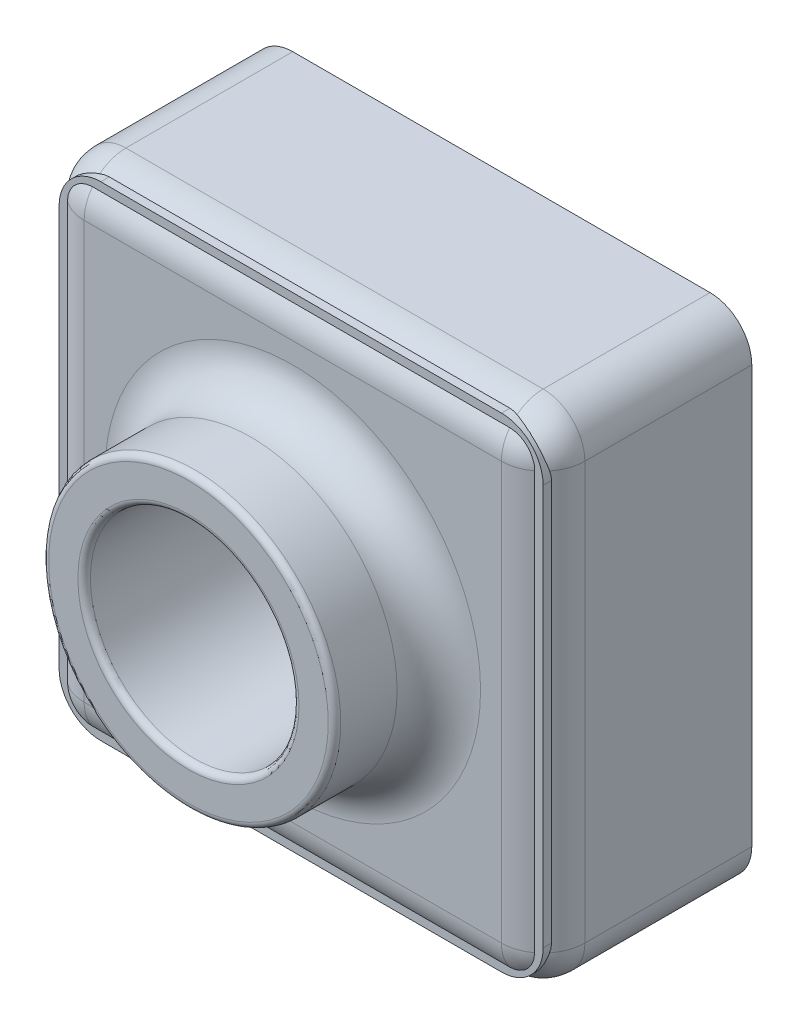
ISO-10303-21;
HEADER;
FILE_DESCRIPTION(('STEP AP214'),'2;1');
FILE_NAME('part.step','',(''),(''),'','','');
FILE_SCHEMA(('AUTOMOTIVE_DESIGN { 1 0 10303 214 1 1 1 1 }'));
ENDSEC;
DATA;
#1=APPLICATION_CONTEXT('core data for automotive mechanical design processes');
#2=APPLICATION_PROTOCOL_DEFINITION('international standard','automotive_design',2000,#1);
#3=PRODUCT_CONTEXT('',#1,'mechanical');
#4=PRODUCT('Part','Part','',(#3));
#5=PRODUCT_RELATED_PRODUCT_CATEGORY('part','',(#4));
#6=PRODUCT_DEFINITION_FORMATION('','',#4);
#7=PRODUCT_DEFINITION_CONTEXT('part definition',#1,'design');
#8=PRODUCT_DEFINITION('design','',#6,#7);
#9=PRODUCT_DEFINITION_SHAPE('','',#8);
#10=(LENGTH_UNIT() NAMED_UNIT(*) SI_UNIT(.MILLI.,.METRE.));
#11=(NAMED_UNIT(*) PLANE_ANGLE_UNIT() SI_UNIT($,.RADIAN.));
#12=(NAMED_UNIT(*) SI_UNIT($,.STERADIAN.) SOLID_ANGLE_UNIT());
#13=UNCERTAINTY_MEASURE_WITH_UNIT(LENGTH_MEASURE(1.E-05),#10,'distance_accuracy_value','');
#14=(GEOMETRIC_REPRESENTATION_CONTEXT(3) GLOBAL_UNCERTAINTY_ASSIGNED_CONTEXT((#13)) GLOBAL_UNIT_ASSIGNED_CONTEXT((#10,
#11,#12)) REPRESENTATION_CONTEXT('',''));
#15=CARTESIAN_POINT('',(0.,0.,0.));
#16=DIRECTION('',(0.,0.,1.));
#17=DIRECTION('',(1.,0.,0.));
#18=AXIS2_PLACEMENT_3D('',#15,#16,#17);
#19=CARTESIAN_POINT('',(0.,0.,0.));
#20=DIRECTION('',(0.,0.,1.));
#21=DIRECTION('',(1.,0.,0.));
#22=AXIS2_PLACEMENT_3D('',#19,#20,#21);
#23=PLANE('',#22);
#24=CARTESIAN_POINT('',(14.1686746987952,-12.4337349397591,0.));
#25=DIRECTION('',(0.,0.,1.));
#26=DIRECTION('',(1.,0.,0.));
#27=AXIS2_PLACEMENT_3D('',#24,#25,#26);
#28=CIRCLE('',#27,25.);
#29=CARTESIAN_POINT('',(39.1686746987952,-12.4337349397591,0.));
#30=VERTEX_POINT('',#29);
#31=EDGE_CURVE('E313',#30,#30,#28,.T.);
#32=ORIENTED_EDGE('',*,*,#31,.T.);
#33=EDGE_LOOP('',(#32));
#34=FACE_BOUND('',#33,.T.);
#35=CARTESIAN_POINT('',(14.1686746987952,-12.4337349397591,0.));
#36=DIRECTION('',(0.,0.,1.));
#37=DIRECTION('',(1.,0.,0.));
#38=AXIS2_PLACEMENT_3D('',#35,#36,#37);
#39=CIRCLE('',#38,27.);
#40=CARTESIAN_POINT('',(41.1686746987952,-12.4337349397591,0.));
#41=VERTEX_POINT('',#40);
#42=EDGE_CURVE('E300',#41,#41,#39,.T.);
#43=ORIENTED_EDGE('',*,*,#42,.F.);
#44=EDGE_LOOP('',(#43));
#45=FACE_BOUND('',#44,.T.);
#46=ADVANCED_FACE('F45',(#34,#45),#23,.F.);
#47=CARTESIAN_POINT('',(-45.8313253012048,47.5662650602409,50.));
#48=DIRECTION('',(1.,0.,0.));
#49=DIRECTION('',(0.,1.,0.));
#50=AXIS2_PLACEMENT_3D('',#47,#48,#49);
#51=PLANE('',#50);
#52=DIRECTION('',(0.,-1.,0.));
#53=VECTOR('',#52,1.);
#54=CARTESIAN_POINT('',(-45.8313253012048,47.5662650602409,40.));
#55=LINE('',#54,#53);
#56=CARTESIAN_POINT('',(-45.8313253012048,-62.4337349397591,40.));
#57=VERTEX_POINT('',#56);
#58=CARTESIAN_POINT('',(-45.8313253012048,37.5662650602409,40.));
#59=VERTEX_POINT('',#58);
#60=EDGE_CURVE('E233',#57,#59,#55,.F.);
#61=ORIENTED_EDGE('',*,*,#60,.T.);
#62=DIRECTION('',(0.,0.,-1.));
#63=VECTOR('',#62,1.);
#64=CARTESIAN_POINT('',(-45.8313253012048,37.5662650602409,50.));
#65=LINE('',#64,#63);
#66=CARTESIAN_POINT('',(-45.8313253012048,37.5662650602409,0.));
#67=VERTEX_POINT('',#66);
#68=EDGE_CURVE('E235',#59,#67,#65,.T.);
#69=ORIENTED_EDGE('',*,*,#68,.T.);
#70=DIRECTION('',(0.,-1.,0.));
#71=VECTOR('',#70,1.);
#72=CARTESIAN_POINT('',(-45.8313253012048,47.5662650602409,0.));
#73=LINE('',#72,#71);
#74=CARTESIAN_POINT('',(-45.8313253012048,-62.433734939759,0.));
#75=VERTEX_POINT('',#74);
#76=EDGE_CURVE('E316',#67,#75,#73,.T.);
#77=ORIENTED_EDGE('',*,*,#76,.T.);
#78=DIRECTION('',(0.,0.,-1.));
#79=VECTOR('',#78,1.);
#80=CARTESIAN_POINT('',(-45.8313253012048,-62.433734939759,50.));
#81=LINE('',#80,#79);
#82=EDGE_CURVE('E231',#75,#57,#81,.F.);
#83=ORIENTED_EDGE('',*,*,#82,.T.);
#84=EDGE_LOOP('',(#61,#69,#77,#83));
#85=FACE_BOUND('',#84,.T.);
#86=ADVANCED_FACE('F369',(#85),#51,.F.);
#87=CARTESIAN_POINT('',(-45.8313253012048,-72.433734939759,50.));
#88=DIRECTION('',(0.,1.,0.));
#89=DIRECTION('',(0.,0.,1.));
#90=AXIS2_PLACEMENT_3D('',#87,#88,#89);
#91=PLANE('',#90);
#92=DIRECTION('',(1.,0.,0.));
#93=VECTOR('',#92,1.);
#94=CARTESIAN_POINT('',(-45.8313253012048,-72.433734939759,40.));
#95=LINE('',#94,#93);
#96=CARTESIAN_POINT('',(64.1686746987952,-72.433734939759,40.));
#97=VERTEX_POINT('',#96);
#98=CARTESIAN_POINT('',(-35.8313253012048,-72.433734939759,40.));
#99=VERTEX_POINT('',#98);
#100=EDGE_CURVE('E227',#97,#99,#95,.F.);
#101=ORIENTED_EDGE('',*,*,#100,.T.);
#102=DIRECTION('',(0.,0.,-1.));
#103=VECTOR('',#102,1.);
#104=CARTESIAN_POINT('',(-35.8313253012048,-72.433734939759,50.));
#105=LINE('',#104,#103);
#106=CARTESIAN_POINT('',(-35.8313253012048,-72.433734939759,0.));
#107=VERTEX_POINT('',#106);
#108=EDGE_CURVE('E229',#99,#107,#105,.T.);
#109=ORIENTED_EDGE('',*,*,#108,.T.);
#110=DIRECTION('',(1.,0.,0.));
#111=VECTOR('',#110,1.);
#112=CARTESIAN_POINT('',(-45.8313253012048,-72.433734939759,0.));
#113=LINE('',#112,#111);
#114=CARTESIAN_POINT('',(64.1686746987952,-72.433734939759,0.));
#115=VERTEX_POINT('',#114);
#116=EDGE_CURVE('E320',#107,#115,#113,.T.);
#117=ORIENTED_EDGE('',*,*,#116,.T.);
#118=DIRECTION('',(0.,0.,-1.));
#119=VECTOR('',#118,1.);
#120=CARTESIAN_POINT('',(64.1686746987952,-72.433734939759,50.));
#121=LINE('',#120,#119);
#122=EDGE_CURVE('E225',#115,#97,#121,.F.);
#123=ORIENTED_EDGE('',*,*,#122,.T.);
#124=EDGE_LOOP('',(#101,#109,#117,#123));
#125=FACE_BOUND('',#124,.T.);
#126=ADVANCED_FACE('F397',(#125),#91,.F.);
#127=CARTESIAN_POINT('',(74.1686746987952,47.5662650602409,50.));
#128=DIRECTION('',(-1.,0.,0.));
#129=DIRECTION('',(0.,0.,1.));
#130=AXIS2_PLACEMENT_3D('',#127,#128,#129);
#131=PLANE('',#130);
#132=DIRECTION('',(0.,1.,0.));
#133=VECTOR('',#132,1.);
#134=CARTESIAN_POINT('',(74.1686746987952,47.5662650602409,0.));
#135=LINE('',#134,#133);
#136=CARTESIAN_POINT('',(74.1686746987952,-62.433734939759,0.));
#137=VERTEX_POINT('',#136);
#138=CARTESIAN_POINT('',(74.1686746987952,37.5662650602409,0.));
#139=VERTEX_POINT('',#138);
#140=EDGE_CURVE('E323',#137,#139,#135,.T.);
#141=ORIENTED_EDGE('',*,*,#140,.T.);
#142=DIRECTION('',(0.,0.,-1.));
#143=VECTOR('',#142,1.);
#144=CARTESIAN_POINT('',(74.1686746987952,37.5662650602409,50.));
#145=LINE('',#144,#143);
#146=CARTESIAN_POINT('',(74.1686746987952,37.5662650602409,40.));
#147=VERTEX_POINT('',#146);
#148=EDGE_CURVE('E223',#139,#147,#145,.F.);
#149=ORIENTED_EDGE('',*,*,#148,.T.);
#150=DIRECTION('',(0.,1.,0.));
#151=VECTOR('',#150,1.);
#152=CARTESIAN_POINT('',(74.1686746987952,-72.433734939759,40.));
#153=LINE('',#152,#151);
#154=CARTESIAN_POINT('',(74.1686746987952,-62.433734939759,40.));
#155=VERTEX_POINT('',#154);
#156=EDGE_CURVE('E221',#147,#155,#153,.F.);
#157=ORIENTED_EDGE('',*,*,#156,.T.);
#158=DIRECTION('',(0.,0.,-1.));
#159=VECTOR('',#158,1.);
#160=CARTESIAN_POINT('',(74.1686746987952,-62.433734939759,50.));
#161=LINE('',#160,#159);
#162=EDGE_CURVE('E219',#155,#137,#161,.T.);
#163=ORIENTED_EDGE('',*,*,#162,.T.);
#164=EDGE_LOOP('',(#141,#149,#157,#163));
#165=FACE_BOUND('',#164,.T.);
#166=ADVANCED_FACE('F599',(#165),#131,.F.);
#167=CARTESIAN_POINT('',(-45.8313253012048,47.5662650602409,50.));
#168=DIRECTION('',(0.,-1.,0.));
#169=DIRECTION('',(0.,0.,-1.));
#170=AXIS2_PLACEMENT_3D('',#167,#168,#169);
#171=PLANE('',#170);
#172=DIRECTION('',(-1.,0.,0.));
#173=VECTOR('',#172,1.);
#174=CARTESIAN_POINT('',(74.1686746987952,47.5662650602409,40.));
#175=LINE('',#174,#173);
#176=CARTESIAN_POINT('',(-35.8313253012048,47.5662650602409,40.));
#177=VERTEX_POINT('',#176);
#178=CARTESIAN_POINT('',(64.1686746987952,47.5662650602409,40.));
#179=VERTEX_POINT('',#178);
#180=EDGE_CURVE('E180',#177,#179,#175,.F.);
#181=ORIENTED_EDGE('',*,*,#180,.T.);
#182=DIRECTION('',(0.,0.,-1.));
#183=VECTOR('',#182,1.);
#184=CARTESIAN_POINT('',(64.1686746987952,47.5662650602409,50.));
#185=LINE('',#184,#183);
#186=CARTESIAN_POINT('',(64.1686746987952,47.5662650602409,0.));
#187=VERTEX_POINT('',#186);
#188=EDGE_CURVE('E217',#179,#187,#185,.T.);
#189=ORIENTED_EDGE('',*,*,#188,.T.);
#190=DIRECTION('',(-1.,0.,0.));
#191=VECTOR('',#190,1.);
#192=CARTESIAN_POINT('',(-45.8313253012048,47.5662650602409,0.));
#193=LINE('',#192,#191);
#194=CARTESIAN_POINT('',(-35.8313253012048,47.5662650602409,0.));
#195=VERTEX_POINT('',#194);
#196=EDGE_CURVE('E326',#187,#195,#193,.T.);
#197=ORIENTED_EDGE('',*,*,#196,.T.);
#198=DIRECTION('',(0.,0.,-1.));
#199=VECTOR('',#198,1.);
#200=CARTESIAN_POINT('',(-35.8313253012048,47.5662650602409,50.));
#201=LINE('',#200,#199);
#202=EDGE_CURVE('E210',#195,#177,#201,.F.);
#203=ORIENTED_EDGE('',*,*,#202,.T.);
#204=EDGE_LOOP('',(#181,#189,#197,#203));
#205=FACE_BOUND('',#204,.T.);
#206=ADVANCED_FACE('F361',(#205),#171,.F.);
#207=CARTESIAN_POINT('',(0.,0.,50.));
#208=DIRECTION('',(0.,0.,1.));
#209=DIRECTION('',(1.,0.,0.));
#210=AXIS2_PLACEMENT_3D('',#207,#208,#209);
#211=PLANE('',#210);
#212=DIRECTION('',(0.,1.,0.));
#213=VECTOR('',#212,1.);
#214=CARTESIAN_POINT('',(64.1686746987952,47.5662650602409,50.));
#215=LINE('',#214,#213);
#216=CARTESIAN_POINT('',(64.1686746987952,-62.4337349397591,50.));
#217=VERTEX_POINT('',#216);
#218=CARTESIAN_POINT('',(64.1686746987952,37.5662650602409,50.));
#219=VERTEX_POINT('',#218);
#220=EDGE_CURVE('E208',#217,#219,#215,.T.);
#221=ORIENTED_EDGE('',*,*,#220,.T.);
#222=DIRECTION('',(-1.,0.,0.));
#223=VECTOR('',#222,1.);
#224=CARTESIAN_POINT('',(-45.8313253012048,37.5662650602409,50.));
#225=LINE('',#224,#223);
#226=CARTESIAN_POINT('',(-35.8313253012048,37.5662650602409,50.));
#227=VERTEX_POINT('',#226);
#228=EDGE_CURVE('E178',#219,#227,#225,.T.);
#229=ORIENTED_EDGE('',*,*,#228,.T.);
#230=DIRECTION('',(0.,-1.,0.));
#231=VECTOR('',#230,1.);
#232=CARTESIAN_POINT('',(-35.8313253012048,-72.433734939759,50.));
#233=LINE('',#232,#231);
#234=CARTESIAN_POINT('',(-35.8313253012048,-62.4337349397591,50.));
#235=VERTEX_POINT('',#234);
#236=EDGE_CURVE('E196',#227,#235,#233,.T.);
#237=ORIENTED_EDGE('',*,*,#236,.T.);
#238=DIRECTION('',(1.,0.,0.));
#239=VECTOR('',#238,1.);
#240=CARTESIAN_POINT('',(74.1686746987952,-62.4337349397591,50.));
#241=LINE('',#240,#239);
#242=EDGE_CURVE('E202',#235,#217,#241,.T.);
#243=ORIENTED_EDGE('',*,*,#242,.T.);
#244=EDGE_LOOP('',(#221,#229,#237,#243));
#245=FACE_BOUND('',#244,.T.);
#246=CARTESIAN_POINT('',(14.1686746987952,-12.4337349397591,50.));
#247=DIRECTION('',(0.,0.,1.));
#248=DIRECTION('',(1.,0.,0.));
#249=AXIS2_PLACEMENT_3D('',#246,#247,#248);
#250=CIRCLE('',#249,45.);
#251=CARTESIAN_POINT('',(59.1686746987952,-12.4337349397591,50.));
#252=VERTEX_POINT('',#251);
#253=EDGE_CURVE('E203',#252,#252,#250,.F.);
#254=ORIENTED_EDGE('',*,*,#253,.T.);
#255=EDGE_LOOP('',(#254));
#256=FACE_BOUND('',#255,.T.);
#257=ADVANCED_FACE('F205',(#245,#256),#211,.T.);
#258=DIRECTION('',(0.,1.,0.));
#259=VECTOR('',#258,1.);
#260=CARTESIAN_POINT('',(72.1686746987952,47.5662650602409,0.));
#261=LINE('',#260,#259);
#262=CARTESIAN_POINT('',(72.1686746987952,-60.433734939759,0.));
#263=VERTEX_POINT('',#262);
#264=CARTESIAN_POINT('',(72.1686746987952,35.5662650602409,0.));
#265=VERTEX_POINT('',#264);
#266=EDGE_CURVE('E412',#263,#265,#261,.T.);
#267=ORIENTED_EDGE('',*,*,#266,.T.);
#268=CARTESIAN_POINT('',(62.1686746987952,35.5662650602409,0.));
#269=DIRECTION('',(0.,0.,1.));
#270=DIRECTION('',(1.,0.,0.));
#271=AXIS2_PLACEMENT_3D('',#268,#269,#270);
#272=CIRCLE('',#271,10.);
#273=CARTESIAN_POINT('',(62.1686746987952,45.5662650602409,0.));
#274=VERTEX_POINT('',#273);
#275=EDGE_CURVE('E70',#265,#274,#272,.T.);
#276=ORIENTED_EDGE('',*,*,#275,.T.);
#277=DIRECTION('',(-1.,0.,0.));
#278=VECTOR('',#277,1.);
#279=CARTESIAN_POINT('',(-45.8313253012048,45.5662650602409,0.));
#280=LINE('',#279,#278);
#281=CARTESIAN_POINT('',(-33.8313253012048,45.5662650602409,0.));
#282=VERTEX_POINT('',#281);
#283=EDGE_CURVE('E416',#274,#282,#280,.T.);
#284=ORIENTED_EDGE('',*,*,#283,.T.);
#285=CARTESIAN_POINT('',(-33.8313253012048,35.5662650602409,0.));
#286=DIRECTION('',(0.,0.,1.));
#287=DIRECTION('',(1.,0.,0.));
#288=AXIS2_PLACEMENT_3D('',#285,#286,#287);
#289=CIRCLE('',#288,10.);
#290=CARTESIAN_POINT('',(-43.8313253012048,35.5662650602409,0.));
#291=VERTEX_POINT('',#290);
#292=EDGE_CURVE('E62',#282,#291,#289,.T.);
#293=ORIENTED_EDGE('',*,*,#292,.T.);
#294=DIRECTION('',(0.,-1.,0.));
#295=VECTOR('',#294,1.);
#296=CARTESIAN_POINT('',(-43.8313253012048,47.5662650602409,0.));
#297=LINE('',#296,#295);
#298=CARTESIAN_POINT('',(-43.8313253012048,-60.433734939759,0.));
#299=VERTEX_POINT('',#298);
#300=EDGE_CURVE('E303',#291,#299,#297,.T.);
#301=ORIENTED_EDGE('',*,*,#300,.T.);
#302=CARTESIAN_POINT('',(-33.8313253012048,-60.433734939759,0.));
#303=DIRECTION('',(0.,0.,1.));
#304=DIRECTION('',(1.,0.,0.));
#305=AXIS2_PLACEMENT_3D('',#302,#303,#304);
#306=CIRCLE('',#305,10.);
#307=CARTESIAN_POINT('',(-33.8313253012048,-70.433734939759,0.));
#308=VERTEX_POINT('',#307);
#309=EDGE_CURVE('E267',#299,#308,#306,.T.);
#310=ORIENTED_EDGE('',*,*,#309,.T.);
#311=DIRECTION('',(1.,0.,0.));
#312=VECTOR('',#311,1.);
#313=CARTESIAN_POINT('',(-45.8313253012048,-70.433734939759,0.));
#314=LINE('',#313,#312);
#315=CARTESIAN_POINT('',(62.1686746987952,-70.433734939759,0.));
#316=VERTEX_POINT('',#315);
#317=EDGE_CURVE('E308',#308,#316,#314,.T.);
#318=ORIENTED_EDGE('',*,*,#317,.T.);
#319=CARTESIAN_POINT('',(62.1686746987952,-60.433734939759,0.));
#320=DIRECTION('',(0.,0.,1.));
#321=DIRECTION('',(1.,0.,0.));
#322=AXIS2_PLACEMENT_3D('',#319,#320,#321);
#323=CIRCLE('',#322,10.);
#324=EDGE_CURVE('E269',#316,#263,#323,.T.);
#325=ORIENTED_EDGE('',*,*,#324,.T.);
#326=EDGE_LOOP('',(#267,#276,#284,#293,#301,#310,#318,#325));
#327=FACE_BOUND('',#326,.T.);
#328=ORIENTED_EDGE('',*,*,#196,.F.);
#329=CARTESIAN_POINT('',(64.1686746987952,37.5662650602409,0.));
#330=DIRECTION('',(0.,0.,1.));
#331=DIRECTION('',(1.,0.,0.));
#332=AXIS2_PLACEMENT_3D('',#329,#330,#331);
#333=CIRCLE('',#332,10.);
#334=EDGE_CURVE('E12',#187,#139,#333,.F.);
#335=ORIENTED_EDGE('',*,*,#334,.T.);
#336=ORIENTED_EDGE('',*,*,#140,.F.);
#337=CARTESIAN_POINT('',(64.1686746987952,-62.433734939759,0.));
#338=DIRECTION('',(0.,0.,1.));
#339=DIRECTION('',(1.,0.,0.));
#340=AXIS2_PLACEMENT_3D('',#337,#338,#339);
#341=CIRCLE('',#340,10.);
#342=EDGE_CURVE('E273',#137,#115,#341,.F.);
#343=ORIENTED_EDGE('',*,*,#342,.T.);
#344=ORIENTED_EDGE('',*,*,#116,.F.);
#345=CARTESIAN_POINT('',(-35.8313253012048,-62.4337349397591,0.));
#346=DIRECTION('',(0.,0.,1.));
#347=DIRECTION('',(1.,0.,0.));
#348=AXIS2_PLACEMENT_3D('',#345,#346,#347);
#349=CIRCLE('',#348,10.);
#350=EDGE_CURVE('E275',#107,#75,#349,.F.);
#351=ORIENTED_EDGE('',*,*,#350,.T.);
#352=ORIENTED_EDGE('',*,*,#76,.F.);
#353=CARTESIAN_POINT('',(-35.8313253012048,37.5662650602409,0.));
#354=DIRECTION('',(0.,0.,1.));
#355=DIRECTION('',(1.,0.,0.));
#356=AXIS2_PLACEMENT_3D('',#353,#354,#355);
#357=CIRCLE('',#356,10.);
#358=EDGE_CURVE('E54',#67,#195,#357,.F.);
#359=ORIENTED_EDGE('',*,*,#358,.T.);
#360=EDGE_LOOP('',(#328,#335,#336,#343,#344,#351,#352,#359));
#361=FACE_BOUND('',#360,.T.);
#362=ADVANCED_FACE('F372',(#327,#361),#23,.F.);
#363=CARTESIAN_POINT('',(14.1686746987952,-12.4337349397591,75.));
#364=DIRECTION('',(0.,0.,-1.));
#365=DIRECTION('',(-1.,0.,0.));
#366=AXIS2_PLACEMENT_3D('',#363,#364,#365);
#367=CYLINDRICAL_SURFACE('',#366,35.);
#368=CARTESIAN_POINT('',(14.1686746987952,-12.4337349397591,60.));
#369=DIRECTION('',(0.,0.,1.));
#370=DIRECTION('',(1.,0.,0.));
#371=AXIS2_PLACEMENT_3D('',#368,#369,#370);
#372=CIRCLE('',#371,35.);
#373=CARTESIAN_POINT('',(49.1686746987952,-12.4337349397591,60.));
#374=VERTEX_POINT('',#373);
#375=EDGE_CURVE('E237',#374,#374,#372,.T.);
#376=ORIENTED_EDGE('',*,*,#375,.T.);
#377=EDGE_LOOP('',(#376));
#378=FACE_BOUND('',#377,.T.);
#379=CARTESIAN_POINT('',(14.1686746987952,-12.4337349397591,73.5));
#380=DIRECTION('',(0.,0.,1.));
#381=DIRECTION('',(1.,0.,0.));
#382=AXIS2_PLACEMENT_3D('',#379,#380,#381);
#383=CIRCLE('',#382,35.);
#384=CARTESIAN_POINT('',(49.1686746987952,-12.4337349397591,73.5));
#385=VERTEX_POINT('',#384);
#386=EDGE_CURVE('E335',#385,#385,#383,.F.);
#387=ORIENTED_EDGE('',*,*,#386,.T.);
#388=EDGE_LOOP('',(#387));
#389=FACE_BOUND('',#388,.T.);
#390=ADVANCED_FACE('F403',(#378,#389),#367,.T.);
#391=CARTESIAN_POINT('',(14.1686746987952,-12.4337349397591,75.));
#392=DIRECTION('',(0.,0.,1.));
#393=DIRECTION('',(1.,0.,0.));
#394=AXIS2_PLACEMENT_3D('',#391,#392,#393);
#395=PLANE('',#394);
#396=CARTESIAN_POINT('',(14.1686746987952,-12.4337349397591,75.));
#397=DIRECTION('',(0.,0.,1.));
#398=DIRECTION('',(1.,0.,0.));
#399=AXIS2_PLACEMENT_3D('',#396,#397,#398);
#400=CIRCLE('',#399,33.5);
#401=CARTESIAN_POINT('',(47.6686746987952,-12.4337349397591,75.));
#402=VERTEX_POINT('',#401);
#403=EDGE_CURVE('E332',#402,#402,#400,.T.);
#404=ORIENTED_EDGE('',*,*,#403,.T.);
#405=EDGE_LOOP('',(#404));
#406=FACE_BOUND('',#405,.T.);
#407=CARTESIAN_POINT('',(14.1686746987952,-12.4337349397591,75.));
#408=DIRECTION('',(0.,0.,1.));
#409=DIRECTION('',(1.,0.,0.));
#410=AXIS2_PLACEMENT_3D('',#407,#408,#409);
#411=CIRCLE('',#410,26.5);
#412=CARTESIAN_POINT('',(40.6686746987952,-12.4337349397591,75.));
#413=VERTEX_POINT('',#412);
#414=EDGE_CURVE('E329',#413,#413,#411,.F.);
#415=ORIENTED_EDGE('',*,*,#414,.T.);
#416=EDGE_LOOP('',(#415));
#417=FACE_BOUND('',#416,.T.);
#418=ADVANCED_FACE('F408',(#406,#417),#395,.T.);
#419=CARTESIAN_POINT('',(14.1686746987952,-12.4337349397591,0.));
#420=DIRECTION('',(0.,0.,1.));
#421=DIRECTION('',(1.,0.,0.));
#422=AXIS2_PLACEMENT_3D('',#419,#420,#421);
#423=CYLINDRICAL_SURFACE('',#422,25.);
#424=CARTESIAN_POINT('',(14.1686746987952,-12.4337349397591,73.5));
#425=DIRECTION('',(0.,0.,1.));
#426=DIRECTION('',(1.,0.,0.));
#427=AXIS2_PLACEMENT_3D('',#424,#425,#426);
#428=CIRCLE('',#427,25.);
#429=CARTESIAN_POINT('',(39.1686746987952,-12.4337349397591,73.5));
#430=VERTEX_POINT('',#429);
#431=EDGE_CURVE('E338',#430,#430,#428,.T.);
#432=ORIENTED_EDGE('',*,*,#431,.T.);
#433=EDGE_LOOP('',(#432));
#434=FACE_BOUND('',#433,.T.);
#435=ORIENTED_EDGE('',*,*,#31,.F.);
#436=EDGE_LOOP('',(#435));
#437=FACE_BOUND('',#436,.T.);
#438=ADVANCED_FACE('F594',(#434,#437),#423,.F.);
#439=CARTESIAN_POINT('',(14.1686746987952,-12.4337349397591,73.5));
#440=DIRECTION('',(0.,0.,1.));
#441=DIRECTION('',(1.,0.,0.));
#442=AXIS2_PLACEMENT_3D('',#439,#440,#441);
#443=TOROIDAL_SURFACE('',#442,33.5,1.5);
#444=ORIENTED_EDGE('',*,*,#386,.F.);
#445=EDGE_LOOP('',(#444));
#446=FACE_BOUND('',#445,.T.);
#447=ORIENTED_EDGE('',*,*,#403,.F.);
#448=EDGE_LOOP('',(#447));
#449=FACE_BOUND('',#448,.T.);
#450=ADVANCED_FACE('F591',(#446,#449),#443,.T.);
#451=CARTESIAN_POINT('',(14.1686746987952,-12.4337349397591,73.5));
#452=DIRECTION('',(0.,0.,1.));
#453=DIRECTION('',(1.,0.,0.));
#454=AXIS2_PLACEMENT_3D('',#451,#452,#453);
#455=TOROIDAL_SURFACE('',#454,26.5,1.5);
#456=ORIENTED_EDGE('',*,*,#414,.F.);
#457=EDGE_LOOP('',(#456));
#458=FACE_BOUND('',#457,.T.);
#459=ORIENTED_EDGE('',*,*,#431,.F.);
#460=EDGE_LOOP('',(#459));
#461=FACE_BOUND('',#460,.T.);
#462=ADVANCED_FACE('F589',(#458,#461),#455,.T.);
#463=CARTESIAN_POINT('',(-43.8313253012048,47.5662650602409,50.));
#464=DIRECTION('',(1.,0.,0.));
#465=DIRECTION('',(0.,1.,0.));
#466=AXIS2_PLACEMENT_3D('',#463,#464,#465);
#467=PLANE('',#466);
#468=DIRECTION('',(0.,-1.,0.));
#469=VECTOR('',#468,1.);
#470=CARTESIAN_POINT('',(-43.8313253012048,47.5662650602409,48.));
#471=LINE('',#470,#469);
#472=CARTESIAN_POINT('',(-43.8313253012048,35.5662650602409,48.));
#473=VERTEX_POINT('',#472);
#474=CARTESIAN_POINT('',(-43.8313253012048,-60.433734939759,48.));
#475=VERTEX_POINT('',#474);
#476=EDGE_CURVE('E417',#473,#475,#471,.T.);
#477=ORIENTED_EDGE('',*,*,#476,.T.);
#478=DIRECTION('',(0.,0.,-1.));
#479=VECTOR('',#478,1.);
#480=CARTESIAN_POINT('',(-43.8313253012048,-60.433734939759,0.));
#481=LINE('',#480,#479);
#482=EDGE_CURVE('E242',#475,#299,#481,.T.);
#483=ORIENTED_EDGE('',*,*,#482,.T.);
#484=ORIENTED_EDGE('',*,*,#300,.F.);
#485=DIRECTION('',(0.,0.,-1.));
#486=VECTOR('',#485,1.);
#487=CARTESIAN_POINT('',(-43.8313253012048,35.5662650602409,48.));
#488=LINE('',#487,#486);
#489=EDGE_CURVE('E240',#291,#473,#488,.F.);
#490=ORIENTED_EDGE('',*,*,#489,.T.);
#491=EDGE_LOOP('',(#477,#483,#484,#490));
#492=FACE_BOUND('',#491,.T.);
#493=ADVANCED_FACE('F441',(#492),#467,.T.);
#494=CARTESIAN_POINT('',(-45.8313253012048,-70.433734939759,50.));
#495=DIRECTION('',(0.,1.,0.));
#496=DIRECTION('',(0.,0.,1.));
#497=AXIS2_PLACEMENT_3D('',#494,#495,#496);
#498=PLANE('',#497);
#499=ORIENTED_EDGE('',*,*,#317,.F.);
#500=DIRECTION('',(0.,0.,-1.));
#501=VECTOR('',#500,1.);
#502=CARTESIAN_POINT('',(-33.8313253012048,-70.433734939759,48.));
#503=LINE('',#502,#501);
#504=CARTESIAN_POINT('',(-33.8313253012048,-70.433734939759,48.));
#505=VERTEX_POINT('',#504);
#506=EDGE_CURVE('E248',#308,#505,#503,.F.);
#507=ORIENTED_EDGE('',*,*,#506,.T.);
#508=DIRECTION('',(1.,0.,0.));
#509=VECTOR('',#508,1.);
#510=CARTESIAN_POINT('',(-45.8313253012048,-70.433734939759,48.));
#511=LINE('',#510,#509);
#512=CARTESIAN_POINT('',(62.1686746987952,-70.433734939759,48.));
#513=VERTEX_POINT('',#512);
#514=EDGE_CURVE('E434',#505,#513,#511,.T.);
#515=ORIENTED_EDGE('',*,*,#514,.T.);
#516=DIRECTION('',(0.,0.,-1.));
#517=VECTOR('',#516,1.);
#518=CARTESIAN_POINT('',(62.1686746987952,-70.433734939759,0.));
#519=LINE('',#518,#517);
#520=EDGE_CURVE('E245',#513,#316,#519,.T.);
#521=ORIENTED_EDGE('',*,*,#520,.T.);
#522=EDGE_LOOP('',(#499,#507,#515,#521));
#523=FACE_BOUND('',#522,.T.);
#524=ADVANCED_FACE('F451',(#523),#498,.T.);
#525=CARTESIAN_POINT('',(72.1686746987952,47.5662650602409,50.));
#526=DIRECTION('',(-1.,0.,0.));
#527=DIRECTION('',(0.,0.,1.));
#528=AXIS2_PLACEMENT_3D('',#525,#526,#527);
#529=PLANE('',#528);
#530=ORIENTED_EDGE('',*,*,#266,.F.);
#531=DIRECTION('',(0.,0.,-1.));
#532=VECTOR('',#531,1.);
#533=CARTESIAN_POINT('',(72.1686746987952,-60.433734939759,48.));
#534=LINE('',#533,#532);
#535=CARTESIAN_POINT('',(72.1686746987952,-60.433734939759,48.));
#536=VERTEX_POINT('',#535);
#537=EDGE_CURVE('E261',#263,#536,#534,.F.);
#538=ORIENTED_EDGE('',*,*,#537,.T.);
#539=DIRECTION('',(0.,1.,0.));
#540=VECTOR('',#539,1.);
#541=CARTESIAN_POINT('',(72.1686746987952,47.5662650602409,48.));
#542=LINE('',#541,#540);
#543=CARTESIAN_POINT('',(72.1686746987952,35.5662650602409,48.));
#544=VERTEX_POINT('',#543);
#545=EDGE_CURVE('E431',#536,#544,#542,.T.);
#546=ORIENTED_EDGE('',*,*,#545,.T.);
#547=DIRECTION('',(0.,0.,-1.));
#548=VECTOR('',#547,1.);
#549=CARTESIAN_POINT('',(72.1686746987952,35.5662650602409,0.));
#550=LINE('',#549,#548);
#551=EDGE_CURVE('E258',#544,#265,#550,.T.);
#552=ORIENTED_EDGE('',*,*,#551,.T.);
#553=EDGE_LOOP('',(#530,#538,#546,#552));
#554=FACE_BOUND('',#553,.T.);
#555=ADVANCED_FACE('F458',(#554),#529,.T.);
#556=CARTESIAN_POINT('',(-45.8313253012048,45.5662650602409,50.));
#557=DIRECTION('',(0.,-1.,0.));
#558=DIRECTION('',(0.,0.,-1.));
#559=AXIS2_PLACEMENT_3D('',#556,#557,#558);
#560=PLANE('',#559);
#561=ORIENTED_EDGE('',*,*,#283,.F.);
#562=DIRECTION('',(0.,0.,-1.));
#563=VECTOR('',#562,1.);
#564=CARTESIAN_POINT('',(62.1686746987952,45.5662650602409,48.));
#565=LINE('',#564,#563);
#566=CARTESIAN_POINT('',(62.1686746987952,45.5662650602409,48.));
#567=VERTEX_POINT('',#566);
#568=EDGE_CURVE('E265',#274,#567,#565,.F.);
#569=ORIENTED_EDGE('',*,*,#568,.T.);
#570=DIRECTION('',(-1.,0.,0.));
#571=VECTOR('',#570,1.);
#572=CARTESIAN_POINT('',(-45.8313253012048,45.5662650602409,48.));
#573=LINE('',#572,#571);
#574=CARTESIAN_POINT('',(-33.8313253012048,45.5662650602409,48.));
#575=VERTEX_POINT('',#574);
#576=EDGE_CURVE('E428',#567,#575,#573,.T.);
#577=ORIENTED_EDGE('',*,*,#576,.T.);
#578=DIRECTION('',(0.,0.,-1.));
#579=VECTOR('',#578,1.);
#580=CARTESIAN_POINT('',(-33.8313253012048,45.5662650602409,0.));
#581=LINE('',#580,#579);
#582=EDGE_CURVE('E263',#575,#282,#581,.T.);
#583=ORIENTED_EDGE('',*,*,#582,.T.);
#584=EDGE_LOOP('',(#561,#569,#577,#583));
#585=FACE_BOUND('',#584,.T.);
#586=ADVANCED_FACE('F467',(#585),#560,.T.);
#587=CARTESIAN_POINT('',(0.,0.,48.));
#588=DIRECTION('',(0.,0.,1.));
#589=DIRECTION('',(1.,0.,0.));
#590=AXIS2_PLACEMENT_3D('',#587,#588,#589);
#591=PLANE('',#590);
#592=CARTESIAN_POINT('',(14.1686746987952,-12.4337349397591,48.));
#593=DIRECTION('',(0.,0.,1.));
#594=DIRECTION('',(1.,0.,0.));
#595=AXIS2_PLACEMENT_3D('',#592,#593,#594);
#596=CIRCLE('',#595,33.);
#597=CARTESIAN_POINT('',(47.1686746987952,-12.4337349397591,48.));
#598=VERTEX_POINT('',#597);
#599=EDGE_CURVE('E425',#598,#598,#596,.T.);
#600=ORIENTED_EDGE('',*,*,#599,.T.);
#601=EDGE_LOOP('',(#600));
#602=FACE_BOUND('',#601,.T.);
#603=ORIENTED_EDGE('',*,*,#514,.F.);
#604=CARTESIAN_POINT('',(-33.8313253012048,-60.433734939759,48.));
#605=DIRECTION('',(0.,0.,1.));
#606=DIRECTION('',(1.,0.,0.));
#607=AXIS2_PLACEMENT_3D('',#604,#605,#606);
#608=CIRCLE('',#607,10.);
#609=EDGE_CURVE('E256',#505,#475,#608,.F.);
#610=ORIENTED_EDGE('',*,*,#609,.T.);
#611=ORIENTED_EDGE('',*,*,#476,.F.);
#612=CARTESIAN_POINT('',(-33.8313253012048,35.5662650602409,48.));
#613=DIRECTION('',(0.,0.,1.));
#614=DIRECTION('',(1.,0.,0.));
#615=AXIS2_PLACEMENT_3D('',#612,#613,#614);
#616=CIRCLE('',#615,10.);
#617=EDGE_CURVE('E250',#473,#575,#616,.F.);
#618=ORIENTED_EDGE('',*,*,#617,.T.);
#619=ORIENTED_EDGE('',*,*,#576,.F.);
#620=CARTESIAN_POINT('',(62.1686746987952,35.5662650602409,48.));
#621=DIRECTION('',(0.,0.,1.));
#622=DIRECTION('',(1.,0.,0.));
#623=AXIS2_PLACEMENT_3D('',#620,#621,#622);
#624=CIRCLE('',#623,10.);
#625=EDGE_CURVE('E252',#567,#544,#624,.F.);
#626=ORIENTED_EDGE('',*,*,#625,.T.);
#627=ORIENTED_EDGE('',*,*,#545,.F.);
#628=CARTESIAN_POINT('',(62.1686746987952,-60.433734939759,48.));
#629=DIRECTION('',(0.,0.,1.));
#630=DIRECTION('',(1.,0.,0.));
#631=AXIS2_PLACEMENT_3D('',#628,#629,#630);
#632=CIRCLE('',#631,10.);
#633=EDGE_CURVE('E254',#536,#513,#632,.F.);
#634=ORIENTED_EDGE('',*,*,#633,.T.);
#635=EDGE_LOOP('',(#603,#610,#611,#618,#619,#626,#627,#634));
#636=FACE_BOUND('',#635,.T.);
#637=ADVANCED_FACE('F460',(#602,#636),#591,.F.);
#638=CARTESIAN_POINT('',(14.1686746987952,-12.4337349397591,75.));
#639=DIRECTION('',(0.,0.,-1.));
#640=DIRECTION('',(-1.,0.,0.));
#641=AXIS2_PLACEMENT_3D('',#638,#639,#640);
#642=CYLINDRICAL_SURFACE('',#641,33.);
#643=CARTESIAN_POINT('',(14.1686746987952,-12.4337349397591,73.));
#644=DIRECTION('',(0.,0.,1.));
#645=DIRECTION('',(1.,0.,0.));
#646=AXIS2_PLACEMENT_3D('',#643,#644,#645);
#647=CIRCLE('',#646,33.);
#648=CARTESIAN_POINT('',(47.1686746987952,-12.4337349397591,73.));
#649=VERTEX_POINT('',#648);
#650=EDGE_CURVE('E422',#649,#649,#647,.T.);
#651=ORIENTED_EDGE('',*,*,#650,.T.);
#652=EDGE_LOOP('',(#651));
#653=FACE_BOUND('',#652,.T.);
#654=ORIENTED_EDGE('',*,*,#599,.F.);
#655=EDGE_LOOP('',(#654));
#656=FACE_BOUND('',#655,.T.);
#657=ADVANCED_FACE('F702',(#653,#656),#642,.F.);
#658=CARTESIAN_POINT('',(14.1686746987952,-12.4337349397591,73.));
#659=DIRECTION('',(0.,0.,1.));
#660=DIRECTION('',(1.,0.,0.));
#661=AXIS2_PLACEMENT_3D('',#658,#659,#660);
#662=PLANE('',#661);
#663=ORIENTED_EDGE('',*,*,#650,.F.);
#664=EDGE_LOOP('',(#663));
#665=FACE_BOUND('',#664,.T.);
#666=CARTESIAN_POINT('',(14.1686746987952,-12.4337349397591,73.));
#667=DIRECTION('',(0.,0.,1.));
#668=DIRECTION('',(1.,0.,0.));
#669=AXIS2_PLACEMENT_3D('',#666,#667,#668);
#670=CIRCLE('',#669,27.);
#671=CARTESIAN_POINT('',(41.1686746987952,-12.4337349397591,73.));
#672=VERTEX_POINT('',#671);
#673=EDGE_CURVE('E317',#672,#672,#670,.T.);
#674=ORIENTED_EDGE('',*,*,#673,.T.);
#675=EDGE_LOOP('',(#674));
#676=FACE_BOUND('',#675,.T.);
#677=ADVANCED_FACE('F711',(#665,#676),#662,.F.);
#678=CARTESIAN_POINT('',(14.1686746987952,-12.4337349397591,0.));
#679=DIRECTION('',(0.,0.,1.));
#680=DIRECTION('',(1.,0.,0.));
#681=AXIS2_PLACEMENT_3D('',#678,#679,#680);
#682=CYLINDRICAL_SURFACE('',#681,27.);
#683=ORIENTED_EDGE('',*,*,#673,.F.);
#684=EDGE_LOOP('',(#683));
#685=FACE_BOUND('',#684,.T.);
#686=ORIENTED_EDGE('',*,*,#42,.T.);
#687=EDGE_LOOP('',(#686));
#688=FACE_BOUND('',#687,.T.);
#689=ADVANCED_FACE('F486',(#685,#688),#682,.T.);
#690=CARTESIAN_POINT('',(64.1686746987952,-62.433734939759,50.));
#691=DIRECTION('',(0.,0.,-1.));
#692=DIRECTION('',(-1.,0.,0.));
#693=AXIS2_PLACEMENT_3D('',#690,#691,#692);
#694=CYLINDRICAL_SURFACE('',#693,10.);
#695=ORIENTED_EDGE('',*,*,#342,.F.);
#696=ORIENTED_EDGE('',*,*,#162,.F.);
#697=CARTESIAN_POINT('',(64.1686746987952,-62.433734939759,40.));
#698=DIRECTION('',(0.,0.,1.));
#699=DIRECTION('',(1.,0.,0.));
#700=AXIS2_PLACEMENT_3D('',#697,#698,#699);
#701=CIRCLE('',#700,10.);
#702=EDGE_CURVE('E49',#97,#155,#701,.T.);
#703=ORIENTED_EDGE('',*,*,#702,.F.);
#704=ORIENTED_EDGE('',*,*,#122,.F.);
#705=EDGE_LOOP('',(#695,#696,#703,#704));
#706=FACE_BOUND('',#705,.T.);
#707=ADVANCED_FACE('F483',(#706),#694,.T.);
#708=CARTESIAN_POINT('',(0.,-62.4337349397591,40.));
#709=DIRECTION('',(-1.,0.,0.));
#710=DIRECTION('',(0.,0.,1.));
#711=AXIS2_PLACEMENT_3D('',#708,#709,#710);
#712=CYLINDRICAL_SURFACE('',#711,10.);
#713=CARTESIAN_POINT('',(-35.8313253012048,-62.433734939759,40.));
#714=DIRECTION('',(-1.,0.,0.));
#715=DIRECTION('',(0.,0.,1.));
#716=AXIS2_PLACEMENT_3D('',#713,#714,#715);
#717=CIRCLE('',#716,10.);
#718=EDGE_CURVE('E292',#99,#235,#717,.T.);
#719=ORIENTED_EDGE('',*,*,#718,.F.);
#720=ORIENTED_EDGE('',*,*,#100,.F.);
#721=CARTESIAN_POINT('',(64.1686746987952,-62.4337349397591,40.));
#722=DIRECTION('',(1.,0.,0.));
#723=DIRECTION('',(0.,0.,-1.));
#724=AXIS2_PLACEMENT_3D('',#721,#722,#723);
#725=CIRCLE('',#724,10.);
#726=EDGE_CURVE('E294',#217,#97,#725,.T.);
#727=ORIENTED_EDGE('',*,*,#726,.F.);
#728=ORIENTED_EDGE('',*,*,#242,.F.);
#729=EDGE_LOOP('',(#719,#720,#727,#728));
#730=FACE_BOUND('',#729,.T.);
#731=ADVANCED_FACE('F345',(#730),#712,.T.);
#732=CARTESIAN_POINT('',(-35.8313253012048,-62.4337349397591,50.));
#733=DIRECTION('',(0.,0.,-1.));
#734=DIRECTION('',(-1.,0.,0.));
#735=AXIS2_PLACEMENT_3D('',#732,#733,#734);
#736=CYLINDRICAL_SURFACE('',#735,10.);
#737=ORIENTED_EDGE('',*,*,#350,.F.);
#738=ORIENTED_EDGE('',*,*,#108,.F.);
#739=CARTESIAN_POINT('',(-35.8313253012048,-62.4337349397591,40.));
#740=DIRECTION('',(0.,0.,1.));
#741=DIRECTION('',(1.,0.,0.));
#742=AXIS2_PLACEMENT_3D('',#739,#740,#741);
#743=CIRCLE('',#742,10.);
#744=EDGE_CURVE('E289',#57,#99,#743,.T.);
#745=ORIENTED_EDGE('',*,*,#744,.F.);
#746=ORIENTED_EDGE('',*,*,#82,.F.);
#747=EDGE_LOOP('',(#737,#738,#745,#746));
#748=FACE_BOUND('',#747,.T.);
#749=ADVANCED_FACE('F377',(#748),#736,.T.);
#750=CARTESIAN_POINT('',(64.1686746987952,-62.4337349397591,40.));
#751=DIRECTION('',(0.,-1.,0.));
#752=DIRECTION('',(0.,0.,-1.));
#753=AXIS2_PLACEMENT_3D('',#750,#751,#752);
#754=SPHERICAL_SURFACE('',#753,10.);
#755=ORIENTED_EDGE('',*,*,#726,.T.);
#756=ORIENTED_EDGE('',*,*,#702,.T.);
#757=CARTESIAN_POINT('',(64.1686746987952,-62.433734939759,40.));
#758=DIRECTION('',(0.,-1.,0.));
#759=DIRECTION('',(0.,0.,-1.));
#760=AXIS2_PLACEMENT_3D('',#757,#758,#759);
#761=CIRCLE('',#760,10.);
#762=EDGE_CURVE('E286',#217,#155,#761,.F.);
#763=ORIENTED_EDGE('',*,*,#762,.F.);
#764=EDGE_LOOP('',(#755,#756,#763));
#765=FACE_BOUND('',#764,.T.);
#766=ADVANCED_FACE('F346',(#765),#754,.T.);
#767=CARTESIAN_POINT('',(-35.8313253012048,-62.4337349397591,40.));
#768=DIRECTION('',(0.,-1.,0.));
#769=DIRECTION('',(0.,0.,-1.));
#770=AXIS2_PLACEMENT_3D('',#767,#768,#769);
#771=SPHERICAL_SURFACE('',#770,10.);
#772=ORIENTED_EDGE('',*,*,#744,.T.);
#773=ORIENTED_EDGE('',*,*,#718,.T.);
#774=CARTESIAN_POINT('',(-35.8313253012048,-62.4337349397591,40.));
#775=DIRECTION('',(0.,-1.,0.));
#776=DIRECTION('',(0.,0.,-1.));
#777=AXIS2_PLACEMENT_3D('',#774,#775,#776);
#778=CIRCLE('',#777,10.);
#779=EDGE_CURVE('E199',#57,#235,#778,.F.);
#780=ORIENTED_EDGE('',*,*,#779,.F.);
#781=EDGE_LOOP('',(#772,#773,#780));
#782=FACE_BOUND('',#781,.T.);
#783=ADVANCED_FACE('F380',(#782),#771,.T.);
#784=CARTESIAN_POINT('',(64.1686746987952,37.5662650602409,50.));
#785=DIRECTION('',(0.,0.,-1.));
#786=DIRECTION('',(-1.,0.,0.));
#787=AXIS2_PLACEMENT_3D('',#784,#785,#786);
#788=CYLINDRICAL_SURFACE('',#787,10.);
#789=ORIENTED_EDGE('',*,*,#334,.F.);
#790=ORIENTED_EDGE('',*,*,#188,.F.);
#791=CARTESIAN_POINT('',(64.1686746987952,37.5662650602409,40.));
#792=DIRECTION('',(0.,0.,1.));
#793=DIRECTION('',(1.,0.,0.));
#794=AXIS2_PLACEMENT_3D('',#791,#792,#793);
#795=CIRCLE('',#794,10.);
#796=EDGE_CURVE('E282',#147,#179,#795,.T.);
#797=ORIENTED_EDGE('',*,*,#796,.F.);
#798=ORIENTED_EDGE('',*,*,#148,.F.);
#799=EDGE_LOOP('',(#789,#790,#797,#798));
#800=FACE_BOUND('',#799,.T.);
#801=ADVANCED_FACE('F358',(#800),#788,.T.);
#802=CARTESIAN_POINT('',(64.1686746987952,0.,40.));
#803=DIRECTION('',(0.,-1.,0.));
#804=DIRECTION('',(0.,0.,-1.));
#805=AXIS2_PLACEMENT_3D('',#802,#803,#804);
#806=CYLINDRICAL_SURFACE('',#805,10.);
#807=ORIENTED_EDGE('',*,*,#762,.T.);
#808=ORIENTED_EDGE('',*,*,#156,.F.);
#809=CARTESIAN_POINT('',(64.1686746987952,37.5662650602409,40.));
#810=DIRECTION('',(0.,1.,0.));
#811=DIRECTION('',(0.,0.,1.));
#812=AXIS2_PLACEMENT_3D('',#809,#810,#811);
#813=CIRCLE('',#812,10.);
#814=EDGE_CURVE('E193',#219,#147,#813,.T.);
#815=ORIENTED_EDGE('',*,*,#814,.F.);
#816=ORIENTED_EDGE('',*,*,#220,.F.);
#817=EDGE_LOOP('',(#807,#808,#815,#816));
#818=FACE_BOUND('',#817,.T.);
#819=ADVANCED_FACE('F349',(#818),#806,.T.);
#820=CARTESIAN_POINT('',(-35.8313253012048,0.,40.));
#821=DIRECTION('',(0.,1.,0.));
#822=DIRECTION('',(-1.,0.,0.));
#823=AXIS2_PLACEMENT_3D('',#820,#821,#822);
#824=CYLINDRICAL_SURFACE('',#823,10.);
#825=ORIENTED_EDGE('',*,*,#779,.T.);
#826=ORIENTED_EDGE('',*,*,#236,.F.);
#827=CARTESIAN_POINT('',(-35.8313253012048,37.5662650602409,40.));
#828=DIRECTION('',(0.,1.,0.));
#829=DIRECTION('',(0.,0.,1.));
#830=AXIS2_PLACEMENT_3D('',#827,#828,#829);
#831=CIRCLE('',#830,10.);
#832=EDGE_CURVE('E186',#59,#227,#831,.T.);
#833=ORIENTED_EDGE('',*,*,#832,.F.);
#834=ORIENTED_EDGE('',*,*,#60,.F.);
#835=EDGE_LOOP('',(#825,#826,#833,#834));
#836=FACE_BOUND('',#835,.T.);
#837=ADVANCED_FACE('F197',(#836),#824,.T.);
#838=CARTESIAN_POINT('',(-35.8313253012048,37.5662650602409,50.));
#839=DIRECTION('',(0.,0.,-1.));
#840=DIRECTION('',(-1.,0.,0.));
#841=AXIS2_PLACEMENT_3D('',#838,#839,#840);
#842=CYLINDRICAL_SURFACE('',#841,10.);
#843=ORIENTED_EDGE('',*,*,#358,.F.);
#844=ORIENTED_EDGE('',*,*,#68,.F.);
#845=CARTESIAN_POINT('',(-35.8313253012048,37.5662650602409,40.));
#846=DIRECTION('',(0.,0.,1.));
#847=DIRECTION('',(1.,0.,0.));
#848=AXIS2_PLACEMENT_3D('',#845,#846,#847);
#849=CIRCLE('',#848,10.);
#850=EDGE_CURVE('E190',#177,#59,#849,.T.);
#851=ORIENTED_EDGE('',*,*,#850,.F.);
#852=ORIENTED_EDGE('',*,*,#202,.F.);
#853=EDGE_LOOP('',(#843,#844,#851,#852));
#854=FACE_BOUND('',#853,.T.);
#855=ADVANCED_FACE('F366',(#854),#842,.T.);
#856=CARTESIAN_POINT('',(64.1686746987952,37.5662650602409,40.));
#857=DIRECTION('',(1.,0.,0.));
#858=DIRECTION('',(0.,0.,-1.));
#859=AXIS2_PLACEMENT_3D('',#856,#857,#858);
#860=SPHERICAL_SURFACE('',#859,10.);
#861=ORIENTED_EDGE('',*,*,#814,.T.);
#862=ORIENTED_EDGE('',*,*,#796,.T.);
#863=CARTESIAN_POINT('',(64.1686746987952,37.5662650602409,40.));
#864=DIRECTION('',(1.,0.,0.));
#865=DIRECTION('',(0.,0.,-1.));
#866=AXIS2_PLACEMENT_3D('',#863,#864,#865);
#867=CIRCLE('',#866,10.);
#868=EDGE_CURVE('E183',#219,#179,#867,.F.);
#869=ORIENTED_EDGE('',*,*,#868,.F.);
#870=EDGE_LOOP('',(#861,#862,#869));
#871=FACE_BOUND('',#870,.T.);
#872=ADVANCED_FACE('F353',(#871),#860,.T.);
#873=CARTESIAN_POINT('',(-35.8313253012048,37.5662650602409,40.));
#874=DIRECTION('',(-1.,0.,0.));
#875=DIRECTION('',(0.,0.,1.));
#876=AXIS2_PLACEMENT_3D('',#873,#874,#875);
#877=SPHERICAL_SURFACE('',#876,10.);
#878=ORIENTED_EDGE('',*,*,#850,.T.);
#879=ORIENTED_EDGE('',*,*,#832,.T.);
#880=CARTESIAN_POINT('',(-35.8313253012048,37.5662650602409,40.));
#881=DIRECTION('',(-1.,0.,0.));
#882=DIRECTION('',(0.,0.,1.));
#883=AXIS2_PLACEMENT_3D('',#880,#881,#882);
#884=CIRCLE('',#883,10.);
#885=EDGE_CURVE('E174',#177,#227,#884,.F.);
#886=ORIENTED_EDGE('',*,*,#885,.F.);
#887=EDGE_LOOP('',(#878,#879,#886));
#888=FACE_BOUND('',#887,.T.);
#889=ADVANCED_FACE('F188',(#888),#877,.T.);
#890=CARTESIAN_POINT('',(0.,37.5662650602409,40.));
#891=DIRECTION('',(1.,0.,0.));
#892=DIRECTION('',(0.,0.,-1.));
#893=AXIS2_PLACEMENT_3D('',#890,#891,#892);
#894=CYLINDRICAL_SURFACE('',#893,10.);
#895=ORIENTED_EDGE('',*,*,#868,.T.);
#896=ORIENTED_EDGE('',*,*,#180,.F.);
#897=ORIENTED_EDGE('',*,*,#885,.T.);
#898=ORIENTED_EDGE('',*,*,#228,.F.);
#899=EDGE_LOOP('',(#895,#896,#897,#898));
#900=FACE_BOUND('',#899,.T.);
#901=ADVANCED_FACE('F176',(#900),#894,.T.);
#902=CARTESIAN_POINT('',(14.1686746987952,-12.4337349397591,60.));
#903=DIRECTION('',(0.,0.,1.));
#904=DIRECTION('',(1.,0.,0.));
#905=AXIS2_PLACEMENT_3D('',#902,#903,#904);
#906=TOROIDAL_SURFACE('',#905,45.,10.);
#907=ORIENTED_EDGE('',*,*,#253,.F.);
#908=EDGE_LOOP('',(#907));
#909=FACE_BOUND('',#908,.T.);
#910=ORIENTED_EDGE('',*,*,#375,.F.);
#911=EDGE_LOOP('',(#910));
#912=FACE_BOUND('',#911,.T.);
#913=ADVANCED_FACE('F479',(#909,#912),#906,.F.);
#914=CARTESIAN_POINT('',(-33.8313253012048,-60.433734939759,50.));
#915=DIRECTION('',(0.,0.,1.));
#916=DIRECTION('',(1.,0.,0.));
#917=AXIS2_PLACEMENT_3D('',#914,#915,#916);
#918=CYLINDRICAL_SURFACE('',#917,10.);
#919=ORIENTED_EDGE('',*,*,#609,.F.);
#920=ORIENTED_EDGE('',*,*,#506,.F.);
#921=ORIENTED_EDGE('',*,*,#309,.F.);
#922=ORIENTED_EDGE('',*,*,#482,.F.);
#923=EDGE_LOOP('',(#919,#920,#921,#922));
#924=FACE_BOUND('',#923,.T.);
#925=ADVANCED_FACE('F447',(#924),#918,.F.);
#926=CARTESIAN_POINT('',(62.1686746987952,-60.433734939759,50.));
#927=DIRECTION('',(0.,0.,1.));
#928=DIRECTION('',(1.,0.,0.));
#929=AXIS2_PLACEMENT_3D('',#926,#927,#928);
#930=CYLINDRICAL_SURFACE('',#929,10.);
#931=ORIENTED_EDGE('',*,*,#633,.F.);
#932=ORIENTED_EDGE('',*,*,#537,.F.);
#933=ORIENTED_EDGE('',*,*,#324,.F.);
#934=ORIENTED_EDGE('',*,*,#520,.F.);
#935=EDGE_LOOP('',(#931,#932,#933,#934));
#936=FACE_BOUND('',#935,.T.);
#937=ADVANCED_FACE('F456',(#936),#930,.F.);
#938=CARTESIAN_POINT('',(62.1686746987952,35.5662650602409,50.));
#939=DIRECTION('',(0.,0.,1.));
#940=DIRECTION('',(1.,0.,0.));
#941=AXIS2_PLACEMENT_3D('',#938,#939,#940);
#942=CYLINDRICAL_SURFACE('',#941,10.);
#943=ORIENTED_EDGE('',*,*,#625,.F.);
#944=ORIENTED_EDGE('',*,*,#568,.F.);
#945=ORIENTED_EDGE('',*,*,#275,.F.);
#946=ORIENTED_EDGE('',*,*,#551,.F.);
#947=EDGE_LOOP('',(#943,#944,#945,#946));
#948=FACE_BOUND('',#947,.T.);
#949=ADVANCED_FACE('F465',(#948),#942,.F.);
#950=CARTESIAN_POINT('',(-33.8313253012048,35.5662650602409,50.));
#951=DIRECTION('',(0.,0.,1.));
#952=DIRECTION('',(1.,0.,0.));
#953=AXIS2_PLACEMENT_3D('',#950,#951,#952);
#954=CYLINDRICAL_SURFACE('',#953,10.);
#955=ORIENTED_EDGE('',*,*,#617,.F.);
#956=ORIENTED_EDGE('',*,*,#489,.F.);
#957=ORIENTED_EDGE('',*,*,#292,.F.);
#958=ORIENTED_EDGE('',*,*,#582,.F.);
#959=EDGE_LOOP('',(#955,#956,#957,#958));
#960=FACE_BOUND('',#959,.T.);
#961=ADVANCED_FACE('F47',(#960),#954,.F.);
#962=CLOSED_SHELL('',(#46,#86,#126,#166,#206,#257,#362,#390,#418,#438,#450,#462,#493,#524,#555,
#586,#637,#657,#677,#689,#707,#731,#749,#766,#783,#801,#819,#837,#855,#872,#889,#901,#913,#925,
#937,#949,#961));
#963=MANIFOLD_SOLID_BREP('B2',#962);
#964=ADVANCED_BREP_SHAPE_REPRESENTATION('',(#18,#963),#14);
#965=SHAPE_DEFINITION_REPRESENTATION(#9,#964);
ENDSEC;
END-ISO-10303-21;
